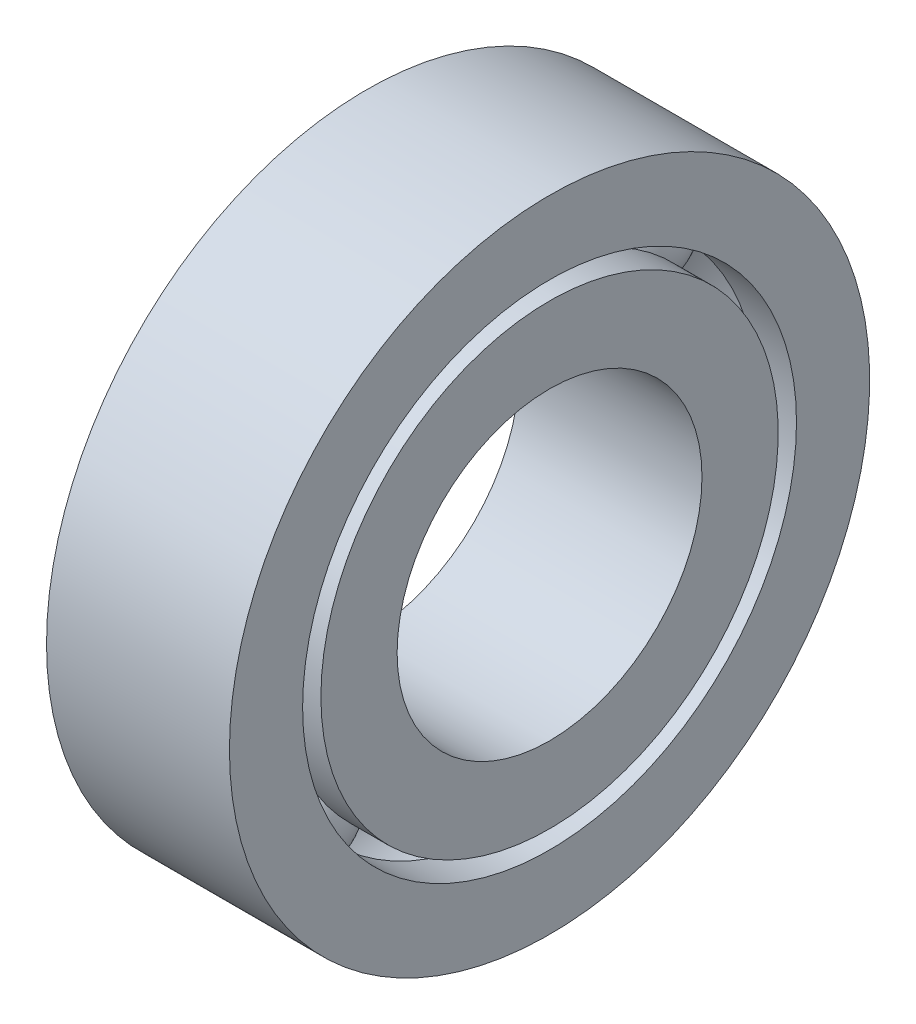
ISO-10303-21;
HEADER;
FILE_DESCRIPTION(('STEP AP214'),'2;1');
FILE_NAME('part.step','',(''),(''),'','','');
FILE_SCHEMA(('AUTOMOTIVE_DESIGN { 1 0 10303 214 1 1 1 1 }'));
ENDSEC;
DATA;
#1=APPLICATION_CONTEXT('core data for automotive mechanical design processes');
#2=APPLICATION_PROTOCOL_DEFINITION('international standard','automotive_design',2000,#1);
#3=PRODUCT_CONTEXT('',#1,'mechanical');
#4=PRODUCT('Part','Part','',(#3));
#5=PRODUCT_RELATED_PRODUCT_CATEGORY('part','',(#4));
#6=PRODUCT_DEFINITION_FORMATION('','',#4);
#7=PRODUCT_DEFINITION_CONTEXT('part definition',#1,'design');
#8=PRODUCT_DEFINITION('design','',#6,#7);
#9=PRODUCT_DEFINITION_SHAPE('','',#8);
#10=(LENGTH_UNIT() NAMED_UNIT(*) SI_UNIT(.MILLI.,.METRE.));
#11=(NAMED_UNIT(*) PLANE_ANGLE_UNIT() SI_UNIT($,.RADIAN.));
#12=(NAMED_UNIT(*) SI_UNIT($,.STERADIAN.) SOLID_ANGLE_UNIT());
#13=UNCERTAINTY_MEASURE_WITH_UNIT(LENGTH_MEASURE(1.E-05),#10,'distance_accuracy_value','');
#14=(GEOMETRIC_REPRESENTATION_CONTEXT(3) GLOBAL_UNCERTAINTY_ASSIGNED_CONTEXT((#13)) GLOBAL_UNIT_ASSIGNED_CONTEXT((#10,
#11,#12)) REPRESENTATION_CONTEXT('',''));
#15=CARTESIAN_POINT('',(0.,0.,0.));
#16=DIRECTION('',(0.,0.,1.));
#17=DIRECTION('',(1.,0.,0.));
#18=AXIS2_PLACEMENT_3D('',#15,#16,#17);
#19=CARTESIAN_POINT('',(6.,11.0308657865103,11.03086578651));
#20=DIRECTION('',(-1.,0.,0.));
#21=DIRECTION('',(0.,0.707106781186556,0.707106781186539));
#22=AXIS2_PLACEMENT_3D('',#19,#20,#21);
#23=SPHERICAL_SURFACE('',#22,3.4);
#24=CARTESIAN_POINT('',(2.6,11.0308657865103,11.03086578651));
#25=VERTEX_POINT('',#24);
#26=VERTEX_LOOP('',#25);
#27=FACE_BOUND('',#26,.T.);
#28=ADVANCED_FACE('F37',(#27),#23,.T.);
#29=CLOSED_SHELL('',(#28));
#30=MANIFOLD_SOLID_BREP('B2',#29);
#31=CARTESIAN_POINT('',(6.,1.63401326657859E-13,15.6));
#32=DIRECTION('',(-1.,0.,0.));
#33=DIRECTION('',(0.,0.,1.));
#34=AXIS2_PLACEMENT_3D('',#31,#32,#33);
#35=SPHERICAL_SURFACE('',#34,3.4);
#36=CARTESIAN_POINT('',(2.6,1.63401326657859E-13,15.6));
#37=VERTEX_POINT('',#36);
#38=VERTEX_LOOP('',#37);
#39=FACE_BOUND('',#38,.T.);
#40=ADVANCED_FACE('F55',(#39),#35,.T.);
#41=CLOSED_SHELL('',(#40));
#42=MANIFOLD_SOLID_BREP('B6',#41);
#43=CARTESIAN_POINT('',(6.,-11.03086578651,11.0308657865102));
#44=DIRECTION('',(-1.,0.,0.));
#45=DIRECTION('',(0.,-0.707106781186541,0.707106781186554));
#46=AXIS2_PLACEMENT_3D('',#43,#44,#45);
#47=SPHERICAL_SURFACE('',#46,3.4);
#48=CARTESIAN_POINT('',(2.6,-11.03086578651,11.0308657865102));
#49=VERTEX_POINT('',#48);
#50=VERTEX_LOOP('',#49);
#51=FACE_BOUND('',#50,.T.);
#52=ADVANCED_FACE('F73',(#51),#47,.T.);
#53=CLOSED_SHELL('',(#52));
#54=MANIFOLD_SOLID_BREP('B33',#53);
#55=CARTESIAN_POINT('',(6.,-15.6,0.));
#56=DIRECTION('',(-1.,0.,0.));
#57=DIRECTION('',(0.,-1.,0.));
#58=AXIS2_PLACEMENT_3D('',#55,#56,#57);
#59=SPHERICAL_SURFACE('',#58,3.4);
#60=CARTESIAN_POINT('',(2.6,-15.6,0.));
#61=VERTEX_POINT('',#60);
#62=VERTEX_LOOP('',#61);
#63=FACE_BOUND('',#62,.T.);
#64=ADVANCED_FACE('F91',(#63),#59,.T.);
#65=CLOSED_SHELL('',(#64));
#66=MANIFOLD_SOLID_BREP('B51',#65);
#67=CARTESIAN_POINT('',(6.,-11.0308657865102,-11.0308657865101));
#68=DIRECTION('',(-1.,0.,0.));
#69=DIRECTION('',(0.,-0.707106781186551,-0.707106781186544));
#70=AXIS2_PLACEMENT_3D('',#67,#68,#69);
#71=SPHERICAL_SURFACE('',#70,3.4);
#72=CARTESIAN_POINT('',(2.6,-11.0308657865102,-11.0308657865101));
#73=VERTEX_POINT('',#72);
#74=VERTEX_LOOP('',#73);
#75=FACE_BOUND('',#74,.T.);
#76=ADVANCED_FACE('F109',(#75),#71,.T.);
#77=CLOSED_SHELL('',(#76));
#78=MANIFOLD_SOLID_BREP('B69',#77);
#79=CARTESIAN_POINT('',(6.,0.,-15.6));
#80=DIRECTION('',(-1.,0.,0.));
#81=DIRECTION('',(0.,0.,-1.));
#82=AXIS2_PLACEMENT_3D('',#79,#80,#81);
#83=SPHERICAL_SURFACE('',#82,3.4);
#84=CARTESIAN_POINT('',(2.6,0.,-15.6));
#85=VERTEX_POINT('',#84);
#86=VERTEX_LOOP('',#85);
#87=FACE_BOUND('',#86,.T.);
#88=ADVANCED_FACE('F127',(#87),#83,.T.);
#89=CLOSED_SHELL('',(#88));
#90=MANIFOLD_SOLID_BREP('B87',#89);
#91=CARTESIAN_POINT('',(6.,11.0308657865101,-11.0308657865102));
#92=DIRECTION('',(-1.,0.,0.));
#93=DIRECTION('',(0.,0.707106781186546,-0.707106781186549));
#94=AXIS2_PLACEMENT_3D('',#91,#92,#93);
#95=SPHERICAL_SURFACE('',#94,3.4);
#96=CARTESIAN_POINT('',(2.6,11.0308657865101,-11.0308657865102));
#97=VERTEX_POINT('',#96);
#98=VERTEX_LOOP('',#97);
#99=FACE_BOUND('',#98,.T.);
#100=ADVANCED_FACE('F145',(#99),#95,.T.);
#101=CLOSED_SHELL('',(#100));
#102=MANIFOLD_SOLID_BREP('B105',#101);
#103=CARTESIAN_POINT('',(6.,15.6,0.));
#104=DIRECTION('',(-1.,0.,0.));
#105=DIRECTION('',(0.,1.,0.));
#106=AXIS2_PLACEMENT_3D('',#103,#104,#105);
#107=SPHERICAL_SURFACE('',#106,3.4);
#108=CARTESIAN_POINT('',(2.6,15.6,0.));
#109=VERTEX_POINT('',#108);
#110=VERTEX_LOOP('',#109);
#111=FACE_BOUND('',#110,.T.);
#112=ADVANCED_FACE('F165',(#111),#107,.T.);
#113=CLOSED_SHELL('',(#112));
#114=MANIFOLD_SOLID_BREP('B123',#113);
#115=CARTESIAN_POINT('',(0.,0.,0.));
#116=DIRECTION('',(-1.,0.,0.));
#117=DIRECTION('',(0.,0.,1.));
#118=AXIS2_PLACEMENT_3D('',#115,#116,#117);
#119=CYLINDRICAL_SURFACE('',#118,21.);
#120=CARTESIAN_POINT('',(0.,0.,0.));
#121=DIRECTION('',(-1.,0.,0.));
#122=DIRECTION('',(0.,0.,1.));
#123=AXIS2_PLACEMENT_3D('',#120,#121,#122);
#124=CIRCLE('',#123,21.);
#125=CARTESIAN_POINT('',(0.,0.,21.));
#126=VERTEX_POINT('',#125);
#127=EDGE_CURVE('E164',#126,#126,#124,.T.);
#128=ORIENTED_EDGE('',*,*,#127,.F.);
#129=EDGE_LOOP('',(#128));
#130=FACE_BOUND('',#129,.T.);
#131=CARTESIAN_POINT('',(12.,0.,0.));
#132=DIRECTION('',(-1.,0.,0.));
#133=DIRECTION('',(0.,0.,1.));
#134=AXIS2_PLACEMENT_3D('',#131,#132,#133);
#135=CIRCLE('',#134,21.);
#136=CARTESIAN_POINT('',(12.,0.,21.));
#137=VERTEX_POINT('',#136);
#138=EDGE_CURVE('E206',#137,#137,#135,.T.);
#139=ORIENTED_EDGE('',*,*,#138,.T.);
#140=EDGE_LOOP('',(#139));
#141=FACE_BOUND('',#140,.T.);
#142=ADVANCED_FACE('F184',(#130,#141),#119,.T.);
#143=CARTESIAN_POINT('',(0.,21.,0.));
#144=DIRECTION('',(1.,0.,0.));
#145=DIRECTION('',(0.,0.,-1.));
#146=AXIS2_PLACEMENT_3D('',#143,#144,#145);
#147=PLANE('',#146);
#148=CARTESIAN_POINT('',(0.,0.,0.));
#149=DIRECTION('',(-1.,0.,0.));
#150=DIRECTION('',(0.,0.,1.));
#151=AXIS2_PLACEMENT_3D('',#148,#149,#150);
#152=CIRCLE('',#151,16.2);
#153=CARTESIAN_POINT('',(0.,0.,16.2));
#154=VERTEX_POINT('',#153);
#155=EDGE_CURVE('E190',#154,#154,#152,.T.);
#156=ORIENTED_EDGE('',*,*,#155,.F.);
#157=EDGE_LOOP('',(#156));
#158=FACE_BOUND('',#157,.T.);
#159=ORIENTED_EDGE('',*,*,#127,.T.);
#160=EDGE_LOOP('',(#159));
#161=FACE_BOUND('',#160,.T.);
#162=ADVANCED_FACE('F231',(#158,#161),#147,.F.);
#163=CARTESIAN_POINT('',(0.,0.,0.));
#164=DIRECTION('',(-1.,0.,0.));
#165=DIRECTION('',(0.,0.,1.));
#166=AXIS2_PLACEMENT_3D('',#163,#164,#165);
#167=CYLINDRICAL_SURFACE('',#166,16.2);
#168=CARTESIAN_POINT('',(2.55181207008667,0.,0.));
#169=DIRECTION('',(-1.,0.,0.));
#170=DIRECTION('',(0.,0.,1.));
#171=AXIS2_PLACEMENT_3D('',#168,#169,#170);
#172=CIRCLE('',#171,16.2);
#173=CARTESIAN_POINT('',(2.55181207008667,0.,16.2));
#174=VERTEX_POINT('',#173);
#175=EDGE_CURVE('E194',#174,#174,#172,.T.);
#176=ORIENTED_EDGE('',*,*,#175,.F.);
#177=EDGE_LOOP('',(#176));
#178=FACE_BOUND('',#177,.T.);
#179=ORIENTED_EDGE('',*,*,#155,.T.);
#180=EDGE_LOOP('',(#179));
#181=FACE_BOUND('',#180,.T.);
#182=ADVANCED_FACE('F226',(#178,#181),#167,.F.);
#183=CARTESIAN_POINT('',(6.,0.,0.));
#184=DIRECTION('',(-1.,0.,0.));
#185=DIRECTION('',(0.,0.,1.));
#186=AXIS2_PLACEMENT_3D('',#183,#184,#185);
#187=TOROIDAL_SURFACE('',#186,15.6,3.5);
#188=CARTESIAN_POINT('',(9.44818792991333,0.,0.));
#189=DIRECTION('',(-1.,0.,0.));
#190=DIRECTION('',(0.,0.,1.));
#191=AXIS2_PLACEMENT_3D('',#188,#189,#190);
#192=CIRCLE('',#191,16.2);
#193=CARTESIAN_POINT('',(9.44818792991333,0.,16.2));
#194=VERTEX_POINT('',#193);
#195=EDGE_CURVE('E198',#194,#194,#192,.T.);
#196=ORIENTED_EDGE('',*,*,#195,.F.);
#197=EDGE_LOOP('',(#196));
#198=FACE_BOUND('',#197,.T.);
#199=ORIENTED_EDGE('',*,*,#175,.T.);
#200=EDGE_LOOP('',(#199));
#201=FACE_BOUND('',#200,.T.);
#202=ADVANCED_FACE('F220',(#198,#201),#187,.F.);
#203=CARTESIAN_POINT('',(0.,0.,0.));
#204=DIRECTION('',(-1.,0.,0.));
#205=DIRECTION('',(0.,0.,1.));
#206=AXIS2_PLACEMENT_3D('',#203,#204,#205);
#207=CYLINDRICAL_SURFACE('',#206,16.2);
#208=CARTESIAN_POINT('',(12.,0.,0.));
#209=DIRECTION('',(-1.,0.,0.));
#210=DIRECTION('',(0.,0.,1.));
#211=AXIS2_PLACEMENT_3D('',#208,#209,#210);
#212=CIRCLE('',#211,16.2);
#213=CARTESIAN_POINT('',(12.,0.,16.2));
#214=VERTEX_POINT('',#213);
#215=EDGE_CURVE('E203',#214,#214,#212,.T.);
#216=ORIENTED_EDGE('',*,*,#215,.F.);
#217=EDGE_LOOP('',(#216));
#218=FACE_BOUND('',#217,.T.);
#219=ORIENTED_EDGE('',*,*,#195,.T.);
#220=EDGE_LOOP('',(#219));
#221=FACE_BOUND('',#220,.T.);
#222=ADVANCED_FACE('F214',(#218,#221),#207,.F.);
#223=CARTESIAN_POINT('',(12.,16.2,0.));
#224=DIRECTION('',(-1.,0.,0.));
#225=DIRECTION('',(0.,0.,1.));
#226=AXIS2_PLACEMENT_3D('',#223,#224,#225);
#227=PLANE('',#226);
#228=ORIENTED_EDGE('',*,*,#138,.F.);
#229=EDGE_LOOP('',(#228));
#230=FACE_BOUND('',#229,.T.);
#231=ORIENTED_EDGE('',*,*,#215,.T.);
#232=EDGE_LOOP('',(#231));
#233=FACE_BOUND('',#232,.T.);
#234=ADVANCED_FACE('F211',(#230,#233),#227,.F.);
#235=CLOSED_SHELL('',(#142,#162,#182,#202,#222,#234));
#236=MANIFOLD_SOLID_BREP('B141',#235);
#237=CARTESIAN_POINT('',(0.,10.,0.));
#238=DIRECTION('',(1.,0.,0.));
#239=DIRECTION('',(0.,0.,-1.));
#240=AXIS2_PLACEMENT_3D('',#237,#238,#239);
#241=PLANE('',#240);
#242=CARTESIAN_POINT('',(0.,0.,0.));
#243=DIRECTION('',(-1.,0.,0.));
#244=DIRECTION('',(0.,0.,1.));
#245=AXIS2_PLACEMENT_3D('',#242,#243,#244);
#246=CIRCLE('',#245,10.);
#247=CARTESIAN_POINT('',(0.,0.,10.));
#248=VERTEX_POINT('',#247);
#249=EDGE_CURVE('E183',#248,#248,#246,.T.);
#250=ORIENTED_EDGE('',*,*,#249,.F.);
#251=EDGE_LOOP('',(#250));
#252=FACE_BOUND('',#251,.T.);
#253=CARTESIAN_POINT('',(0.,0.,0.));
#254=DIRECTION('',(-1.,0.,0.));
#255=DIRECTION('',(0.,0.,1.));
#256=AXIS2_PLACEMENT_3D('',#253,#254,#255);
#257=CIRCLE('',#256,15.);
#258=CARTESIAN_POINT('',(0.,0.,15.));
#259=VERTEX_POINT('',#258);
#260=EDGE_CURVE('E297',#259,#259,#257,.T.);
#261=ORIENTED_EDGE('',*,*,#260,.T.);
#262=EDGE_LOOP('',(#261));
#263=FACE_BOUND('',#262,.T.);
#264=ADVANCED_FACE('F275',(#252,#263),#241,.F.);
#265=CARTESIAN_POINT('',(0.,0.,0.));
#266=DIRECTION('',(-1.,0.,0.));
#267=DIRECTION('',(0.,0.,1.));
#268=AXIS2_PLACEMENT_3D('',#265,#266,#267);
#269=CYLINDRICAL_SURFACE('',#268,10.);
#270=CARTESIAN_POINT('',(12.,0.,0.));
#271=DIRECTION('',(-1.,0.,0.));
#272=DIRECTION('',(0.,0.,1.));
#273=AXIS2_PLACEMENT_3D('',#270,#271,#272);
#274=CIRCLE('',#273,10.);
#275=CARTESIAN_POINT('',(12.,0.,10.));
#276=VERTEX_POINT('',#275);
#277=EDGE_CURVE('E281',#276,#276,#274,.T.);
#278=ORIENTED_EDGE('',*,*,#277,.F.);
#279=EDGE_LOOP('',(#278));
#280=FACE_BOUND('',#279,.T.);
#281=ORIENTED_EDGE('',*,*,#249,.T.);
#282=EDGE_LOOP('',(#281));
#283=FACE_BOUND('',#282,.T.);
#284=ADVANCED_FACE('F322',(#280,#283),#269,.F.);
#285=CARTESIAN_POINT('',(12.,10.,0.));
#286=DIRECTION('',(-1.,0.,0.));
#287=DIRECTION('',(0.,0.,1.));
#288=AXIS2_PLACEMENT_3D('',#285,#286,#287);
#289=PLANE('',#288);
#290=CARTESIAN_POINT('',(12.,0.,0.));
#291=DIRECTION('',(-1.,0.,0.));
#292=DIRECTION('',(0.,0.,1.));
#293=AXIS2_PLACEMENT_3D('',#290,#291,#292);
#294=CIRCLE('',#293,15.);
#295=CARTESIAN_POINT('',(12.,0.,15.));
#296=VERTEX_POINT('',#295);
#297=EDGE_CURVE('E285',#296,#296,#294,.T.);
#298=ORIENTED_EDGE('',*,*,#297,.F.);
#299=EDGE_LOOP('',(#298));
#300=FACE_BOUND('',#299,.T.);
#301=ORIENTED_EDGE('',*,*,#277,.T.);
#302=EDGE_LOOP('',(#301));
#303=FACE_BOUND('',#302,.T.);
#304=ADVANCED_FACE('F317',(#300,#303),#289,.F.);
#305=CARTESIAN_POINT('',(0.,0.,0.));
#306=DIRECTION('',(-1.,0.,0.));
#307=DIRECTION('',(0.,0.,1.));
#308=AXIS2_PLACEMENT_3D('',#305,#306,#307);
#309=CYLINDRICAL_SURFACE('',#308,15.);
#310=CARTESIAN_POINT('',(9.44818792991333,0.,0.));
#311=DIRECTION('',(-1.,0.,0.));
#312=DIRECTION('',(0.,0.,1.));
#313=AXIS2_PLACEMENT_3D('',#310,#311,#312);
#314=CIRCLE('',#313,15.);
#315=CARTESIAN_POINT('',(9.44818792991333,0.,15.));
#316=VERTEX_POINT('',#315);
#317=EDGE_CURVE('E289',#316,#316,#314,.T.);
#318=ORIENTED_EDGE('',*,*,#317,.F.);
#319=EDGE_LOOP('',(#318));
#320=FACE_BOUND('',#319,.T.);
#321=ORIENTED_EDGE('',*,*,#297,.T.);
#322=EDGE_LOOP('',(#321));
#323=FACE_BOUND('',#322,.T.);
#324=ADVANCED_FACE('F311',(#320,#323),#309,.T.);
#325=CARTESIAN_POINT('',(6.,0.,0.));
#326=DIRECTION('',(-1.,0.,0.));
#327=DIRECTION('',(0.,0.,1.));
#328=AXIS2_PLACEMENT_3D('',#325,#326,#327);
#329=TOROIDAL_SURFACE('',#328,15.6,3.5);
#330=CARTESIAN_POINT('',(2.55181207008667,0.,0.));
#331=DIRECTION('',(-1.,0.,0.));
#332=DIRECTION('',(0.,0.,1.));
#333=AXIS2_PLACEMENT_3D('',#330,#331,#332);
#334=CIRCLE('',#333,15.);
#335=CARTESIAN_POINT('',(2.55181207008667,0.,15.));
#336=VERTEX_POINT('',#335);
#337=EDGE_CURVE('E294',#336,#336,#334,.T.);
#338=ORIENTED_EDGE('',*,*,#337,.F.);
#339=EDGE_LOOP('',(#338));
#340=FACE_BOUND('',#339,.T.);
#341=ORIENTED_EDGE('',*,*,#317,.T.);
#342=EDGE_LOOP('',(#341));
#343=FACE_BOUND('',#342,.T.);
#344=ADVANCED_FACE('F305',(#340,#343),#329,.F.);
#345=CARTESIAN_POINT('',(0.,0.,0.));
#346=DIRECTION('',(-1.,0.,0.));
#347=DIRECTION('',(0.,0.,1.));
#348=AXIS2_PLACEMENT_3D('',#345,#346,#347);
#349=CYLINDRICAL_SURFACE('',#348,15.);
#350=ORIENTED_EDGE('',*,*,#260,.F.);
#351=EDGE_LOOP('',(#350));
#352=FACE_BOUND('',#351,.T.);
#353=ORIENTED_EDGE('',*,*,#337,.T.);
#354=EDGE_LOOP('',(#353));
#355=FACE_BOUND('',#354,.T.);
#356=ADVANCED_FACE('F302',(#352,#355),#349,.T.);
#357=CLOSED_SHELL('',(#264,#284,#304,#324,#344,#356));
#358=MANIFOLD_SOLID_BREP('B159',#357);
#359=ADVANCED_BREP_SHAPE_REPRESENTATION('',(#18,#30,#42,#54,#66,#78,#90,#102,#114,#236,#358),#14);
#360=SHAPE_DEFINITION_REPRESENTATION(#9,#359);
ENDSEC;
END-ISO-10303-21;
